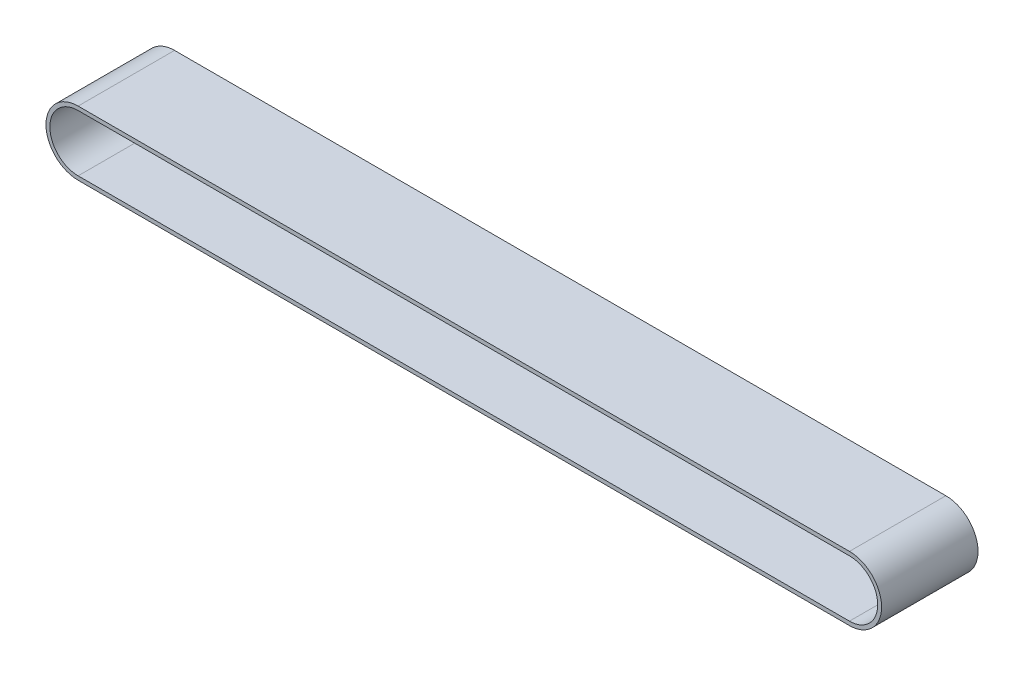
ISO-10303-21;
HEADER;
FILE_DESCRIPTION(('STEP AP214'),'2;1');
FILE_NAME('part.step','',(''),(''),'','','');
FILE_SCHEMA(('AUTOMOTIVE_DESIGN { 1 0 10303 214 1 1 1 1 }'));
ENDSEC;
DATA;
#1=APPLICATION_CONTEXT('core data for automotive mechanical design processes');
#2=APPLICATION_PROTOCOL_DEFINITION('international standard','automotive_design',2000,#1);
#3=PRODUCT_CONTEXT('',#1,'mechanical');
#4=PRODUCT('Part','Part','',(#3));
#5=PRODUCT_RELATED_PRODUCT_CATEGORY('part','',(#4));
#6=PRODUCT_DEFINITION_FORMATION('','',#4);
#7=PRODUCT_DEFINITION_CONTEXT('part definition',#1,'design');
#8=PRODUCT_DEFINITION('design','',#6,#7);
#9=PRODUCT_DEFINITION_SHAPE('','',#8);
#10=(LENGTH_UNIT() NAMED_UNIT(*) SI_UNIT(.MILLI.,.METRE.));
#11=(NAMED_UNIT(*) PLANE_ANGLE_UNIT() SI_UNIT($,.RADIAN.));
#12=(NAMED_UNIT(*) SI_UNIT($,.STERADIAN.) SOLID_ANGLE_UNIT());
#13=UNCERTAINTY_MEASURE_WITH_UNIT(LENGTH_MEASURE(1.E-05),#10,'distance_accuracy_value','');
#14=(GEOMETRIC_REPRESENTATION_CONTEXT(3) GLOBAL_UNCERTAINTY_ASSIGNED_CONTEXT((#13)) GLOBAL_UNIT_ASSIGNED_CONTEXT((#10,
#11,#12)) REPRESENTATION_CONTEXT('',''));
#15=CARTESIAN_POINT('',(0.,0.,0.));
#16=DIRECTION('',(0.,0.,1.));
#17=DIRECTION('',(1.,0.,0.));
#18=AXIS2_PLACEMENT_3D('',#15,#16,#17);
#19=CARTESIAN_POINT('',(0.,-50.,75.));
#20=DIRECTION('',(0.,1.,0.));
#21=DIRECTION('',(0.,0.,1.));
#22=AXIS2_PLACEMENT_3D('',#19,#20,#21);
#23=PLANE('',#22);
#24=DIRECTION('',(1.,0.,0.));
#25=VECTOR('',#24,1.);
#26=CARTESIAN_POINT('',(0.,-50.,-75.));
#27=LINE('',#26,#25);
#28=CARTESIAN_POINT('',(0.,-50.,-75.));
#29=VERTEX_POINT('',#28);
#30=CARTESIAN_POINT('',(1200.,-50.,-75.));
#31=VERTEX_POINT('',#30);
#32=EDGE_CURVE('E152',#29,#31,#27,.T.);
#33=ORIENTED_EDGE('',*,*,#32,.T.);
#34=DIRECTION('',(0.,0.,-1.));
#35=VECTOR('',#34,1.);
#36=CARTESIAN_POINT('',(1200.,-50.,75.));
#37=LINE('',#36,#35);
#38=CARTESIAN_POINT('',(1200.,-50.,75.));
#39=VERTEX_POINT('',#38);
#40=EDGE_CURVE('E11',#39,#31,#37,.T.);
#41=ORIENTED_EDGE('',*,*,#40,.F.);
#42=DIRECTION('',(1.,0.,0.));
#43=VECTOR('',#42,1.);
#44=CARTESIAN_POINT('',(0.,-50.,75.));
#45=LINE('',#44,#43);
#46=CARTESIAN_POINT('',(0.,-50.,75.));
#47=VERTEX_POINT('',#46);
#48=EDGE_CURVE('E123',#47,#39,#45,.T.);
#49=ORIENTED_EDGE('',*,*,#48,.F.);
#50=DIRECTION('',(0.,0.,-1.));
#51=VECTOR('',#50,1.);
#52=CARTESIAN_POINT('',(0.,-50.,75.));
#53=LINE('',#52,#51);
#54=EDGE_CURVE('E160',#47,#29,#53,.T.);
#55=ORIENTED_EDGE('',*,*,#54,.T.);
#56=EDGE_LOOP('',(#33,#41,#49,#55));
#57=FACE_BOUND('',#56,.T.);
#58=ADVANCED_FACE('F46',(#57),#23,.F.);
#59=CARTESIAN_POINT('',(1200.,0.,75.));
#60=DIRECTION('',(0.,0.,-1.));
#61=DIRECTION('',(-1.,0.,0.));
#62=AXIS2_PLACEMENT_3D('',#59,#60,#61);
#63=CYLINDRICAL_SURFACE('',#62,50.);
#64=CARTESIAN_POINT('',(1200.,0.,-75.));
#65=DIRECTION('',(0.,0.,1.));
#66=DIRECTION('',(1.,0.,0.));
#67=AXIS2_PLACEMENT_3D('',#64,#65,#66);
#68=CIRCLE('',#67,50.);
#69=CARTESIAN_POINT('',(1200.,50.,-75.));
#70=VERTEX_POINT('',#69);
#71=EDGE_CURVE('E129',#31,#70,#68,.T.);
#72=ORIENTED_EDGE('',*,*,#71,.T.);
#73=DIRECTION('',(0.,0.,-1.));
#74=VECTOR('',#73,1.);
#75=CARTESIAN_POINT('',(1200.,50.,75.));
#76=LINE('',#75,#74);
#77=CARTESIAN_POINT('',(1200.,50.,75.));
#78=VERTEX_POINT('',#77);
#79=EDGE_CURVE('E56',#78,#70,#76,.T.);
#80=ORIENTED_EDGE('',*,*,#79,.F.);
#81=CARTESIAN_POINT('',(1200.,0.,75.));
#82=DIRECTION('',(0.,0.,1.));
#83=DIRECTION('',(1.,0.,0.));
#84=AXIS2_PLACEMENT_3D('',#81,#82,#83);
#85=CIRCLE('',#84,50.);
#86=EDGE_CURVE('E117',#39,#78,#85,.T.);
#87=ORIENTED_EDGE('',*,*,#86,.F.);
#88=ORIENTED_EDGE('',*,*,#40,.T.);
#89=EDGE_LOOP('',(#72,#80,#87,#88));
#90=FACE_BOUND('',#89,.T.);
#91=ADVANCED_FACE('F128',(#90),#63,.T.);
#92=CARTESIAN_POINT('',(0.,50.,75.));
#93=DIRECTION('',(0.,1.,0.));
#94=DIRECTION('',(0.,0.,1.));
#95=AXIS2_PLACEMENT_3D('',#92,#93,#94);
#96=PLANE('',#95);
#97=DIRECTION('',(1.,0.,0.));
#98=VECTOR('',#97,1.);
#99=CARTESIAN_POINT('',(0.,50.,-75.));
#100=LINE('',#99,#98);
#101=CARTESIAN_POINT('',(0.,50.,-75.));
#102=VERTEX_POINT('',#101);
#103=EDGE_CURVE('E156',#102,#70,#100,.T.);
#104=ORIENTED_EDGE('',*,*,#103,.F.);
#105=DIRECTION('',(0.,0.,-1.));
#106=VECTOR('',#105,1.);
#107=CARTESIAN_POINT('',(0.,50.,75.));
#108=LINE('',#107,#106);
#109=CARTESIAN_POINT('',(0.,50.,75.));
#110=VERTEX_POINT('',#109);
#111=EDGE_CURVE('E93',#110,#102,#108,.T.);
#112=ORIENTED_EDGE('',*,*,#111,.F.);
#113=DIRECTION('',(1.,0.,0.));
#114=VECTOR('',#113,1.);
#115=CARTESIAN_POINT('',(0.,50.,75.));
#116=LINE('',#115,#114);
#117=EDGE_CURVE('E121',#110,#78,#116,.T.);
#118=ORIENTED_EDGE('',*,*,#117,.T.);
#119=ORIENTED_EDGE('',*,*,#79,.T.);
#120=EDGE_LOOP('',(#104,#112,#118,#119));
#121=FACE_BOUND('',#120,.T.);
#122=ADVANCED_FACE('F134',(#121),#96,.T.);
#123=CARTESIAN_POINT('',(0.,0.,75.));
#124=DIRECTION('',(0.,0.,-1.));
#125=DIRECTION('',(-1.,0.,0.));
#126=AXIS2_PLACEMENT_3D('',#123,#124,#125);
#127=CYLINDRICAL_SURFACE('',#126,44.);
#128=CARTESIAN_POINT('',(0.,0.,-75.));
#129=DIRECTION('',(0.,0.,1.));
#130=DIRECTION('',(1.,0.,0.));
#131=AXIS2_PLACEMENT_3D('',#128,#129,#130);
#132=CIRCLE('',#131,44.);
#133=CARTESIAN_POINT('',(0.,44.,-75.));
#134=VERTEX_POINT('',#133);
#135=CARTESIAN_POINT('',(0.,-44.,-75.));
#136=VERTEX_POINT('',#135);
#137=EDGE_CURVE('E140',#134,#136,#132,.T.);
#138=ORIENTED_EDGE('',*,*,#137,.F.);
#139=DIRECTION('',(0.,0.,-1.));
#140=VECTOR('',#139,1.);
#141=CARTESIAN_POINT('',(0.,44.,75.));
#142=LINE('',#141,#140);
#143=CARTESIAN_POINT('',(0.,44.,75.));
#144=VERTEX_POINT('',#143);
#145=EDGE_CURVE('E50',#144,#134,#142,.T.);
#146=ORIENTED_EDGE('',*,*,#145,.F.);
#147=CARTESIAN_POINT('',(0.,0.,75.));
#148=DIRECTION('',(0.,0.,1.));
#149=DIRECTION('',(1.,0.,0.));
#150=AXIS2_PLACEMENT_3D('',#147,#148,#149);
#151=CIRCLE('',#150,44.);
#152=CARTESIAN_POINT('',(0.,-44.,75.));
#153=VERTEX_POINT('',#152);
#154=EDGE_CURVE('E159',#144,#153,#151,.T.);
#155=ORIENTED_EDGE('',*,*,#154,.T.);
#156=DIRECTION('',(0.,0.,-1.));
#157=VECTOR('',#156,1.);
#158=CARTESIAN_POINT('',(0.,-44.,75.));
#159=LINE('',#158,#157);
#160=EDGE_CURVE('E136',#153,#136,#159,.T.);
#161=ORIENTED_EDGE('',*,*,#160,.T.);
#162=EDGE_LOOP('',(#138,#146,#155,#161));
#163=FACE_BOUND('',#162,.T.);
#164=ADVANCED_FACE('F48',(#163),#127,.F.);
#165=CARTESIAN_POINT('',(0.,44.,75.));
#166=DIRECTION('',(0.,1.,0.));
#167=DIRECTION('',(-1.,0.,0.));
#168=AXIS2_PLACEMENT_3D('',#165,#166,#167);
#169=PLANE('',#168);
#170=DIRECTION('',(1.,0.,0.));
#171=VECTOR('',#170,1.);
#172=CARTESIAN_POINT('',(0.,44.,-75.));
#173=LINE('',#172,#171);
#174=CARTESIAN_POINT('',(1200.,44.,-75.));
#175=VERTEX_POINT('',#174);
#176=EDGE_CURVE('E143',#134,#175,#173,.T.);
#177=ORIENTED_EDGE('',*,*,#176,.T.);
#178=DIRECTION('',(0.,0.,-1.));
#179=VECTOR('',#178,1.);
#180=CARTESIAN_POINT('',(1200.,44.,75.));
#181=LINE('',#180,#179);
#182=CARTESIAN_POINT('',(1200.,44.,75.));
#183=VERTEX_POINT('',#182);
#184=EDGE_CURVE('E165',#183,#175,#181,.T.);
#185=ORIENTED_EDGE('',*,*,#184,.F.);
#186=DIRECTION('',(1.,0.,0.));
#187=VECTOR('',#186,1.);
#188=CARTESIAN_POINT('',(0.,44.,75.));
#189=LINE('',#188,#187);
#190=EDGE_CURVE('E173',#144,#183,#189,.T.);
#191=ORIENTED_EDGE('',*,*,#190,.F.);
#192=ORIENTED_EDGE('',*,*,#145,.T.);
#193=EDGE_LOOP('',(#177,#185,#191,#192));
#194=FACE_BOUND('',#193,.T.);
#195=ADVANCED_FACE('F172',(#194),#169,.F.);
#196=CARTESIAN_POINT('',(1200.,0.,75.));
#197=DIRECTION('',(0.,0.,-1.));
#198=DIRECTION('',(-1.,0.,0.));
#199=AXIS2_PLACEMENT_3D('',#196,#197,#198);
#200=CYLINDRICAL_SURFACE('',#199,44.);
#201=CARTESIAN_POINT('',(1200.,0.,-75.));
#202=DIRECTION('',(0.,0.,1.));
#203=DIRECTION('',(1.,0.,0.));
#204=AXIS2_PLACEMENT_3D('',#201,#202,#203);
#205=CIRCLE('',#204,44.);
#206=CARTESIAN_POINT('',(1200.,-44.,-75.));
#207=VERTEX_POINT('',#206);
#208=EDGE_CURVE('E146',#207,#175,#205,.T.);
#209=ORIENTED_EDGE('',*,*,#208,.F.);
#210=DIRECTION('',(0.,0.,-1.));
#211=VECTOR('',#210,1.);
#212=CARTESIAN_POINT('',(1200.,-44.,75.));
#213=LINE('',#212,#211);
#214=CARTESIAN_POINT('',(1200.,-44.,75.));
#215=VERTEX_POINT('',#214);
#216=EDGE_CURVE('E164',#215,#207,#213,.T.);
#217=ORIENTED_EDGE('',*,*,#216,.F.);
#218=CARTESIAN_POINT('',(1200.,0.,75.));
#219=DIRECTION('',(0.,0.,1.));
#220=DIRECTION('',(1.,0.,0.));
#221=AXIS2_PLACEMENT_3D('',#218,#219,#220);
#222=CIRCLE('',#221,44.);
#223=EDGE_CURVE('E213',#215,#183,#222,.T.);
#224=ORIENTED_EDGE('',*,*,#223,.T.);
#225=ORIENTED_EDGE('',*,*,#184,.T.);
#226=EDGE_LOOP('',(#209,#217,#224,#225));
#227=FACE_BOUND('',#226,.T.);
#228=ADVANCED_FACE('F185',(#227),#200,.F.);
#229=CARTESIAN_POINT('',(0.,-44.,75.));
#230=DIRECTION('',(0.,1.,0.));
#231=DIRECTION('',(-1.,0.,0.));
#232=AXIS2_PLACEMENT_3D('',#229,#230,#231);
#233=PLANE('',#232);
#234=DIRECTION('',(1.,0.,0.));
#235=VECTOR('',#234,1.);
#236=CARTESIAN_POINT('',(0.,-44.,-75.));
#237=LINE('',#236,#235);
#238=EDGE_CURVE('E149',#136,#207,#237,.T.);
#239=ORIENTED_EDGE('',*,*,#238,.F.);
#240=ORIENTED_EDGE('',*,*,#160,.F.);
#241=DIRECTION('',(1.,0.,0.));
#242=VECTOR('',#241,1.);
#243=CARTESIAN_POINT('',(0.,-44.,75.));
#244=LINE('',#243,#242);
#245=EDGE_CURVE('E183',#153,#215,#244,.T.);
#246=ORIENTED_EDGE('',*,*,#245,.T.);
#247=ORIENTED_EDGE('',*,*,#216,.T.);
#248=EDGE_LOOP('',(#239,#240,#246,#247));
#249=FACE_BOUND('',#248,.T.);
#250=ADVANCED_FACE('F182',(#249),#233,.T.);
#251=CARTESIAN_POINT('',(0.,0.,75.));
#252=DIRECTION('',(0.,0.,-1.));
#253=DIRECTION('',(-1.,0.,0.));
#254=AXIS2_PLACEMENT_3D('',#251,#252,#253);
#255=CYLINDRICAL_SURFACE('',#254,50.);
#256=CARTESIAN_POINT('',(0.,0.,-75.));
#257=DIRECTION('',(0.,0.,1.));
#258=DIRECTION('',(1.,0.,0.));
#259=AXIS2_PLACEMENT_3D('',#256,#257,#258);
#260=CIRCLE('',#259,50.);
#261=EDGE_CURVE('E96',#102,#29,#260,.T.);
#262=ORIENTED_EDGE('',*,*,#261,.T.);
#263=ORIENTED_EDGE('',*,*,#54,.F.);
#264=CARTESIAN_POINT('',(0.,0.,75.));
#265=DIRECTION('',(0.,0.,1.));
#266=DIRECTION('',(1.,0.,0.));
#267=AXIS2_PLACEMENT_3D('',#264,#265,#266);
#268=CIRCLE('',#267,50.);
#269=EDGE_CURVE('E65',#110,#47,#268,.T.);
#270=ORIENTED_EDGE('',*,*,#269,.F.);
#271=ORIENTED_EDGE('',*,*,#111,.T.);
#272=EDGE_LOOP('',(#262,#263,#270,#271));
#273=FACE_BOUND('',#272,.T.);
#274=ADVANCED_FACE('F192',(#273),#255,.T.);
#275=CARTESIAN_POINT('',(0.,0.,75.));
#276=DIRECTION('',(0.,0.,1.));
#277=DIRECTION('',(1.,0.,0.));
#278=AXIS2_PLACEMENT_3D('',#275,#276,#277);
#279=PLANE('',#278);
#280=ORIENTED_EDGE('',*,*,#154,.F.);
#281=ORIENTED_EDGE('',*,*,#190,.T.);
#282=ORIENTED_EDGE('',*,*,#223,.F.);
#283=ORIENTED_EDGE('',*,*,#245,.F.);
#284=EDGE_LOOP('',(#280,#281,#282,#283));
#285=FACE_BOUND('',#284,.T.);
#286=ORIENTED_EDGE('',*,*,#48,.T.);
#287=ORIENTED_EDGE('',*,*,#86,.T.);
#288=ORIENTED_EDGE('',*,*,#117,.F.);
#289=ORIENTED_EDGE('',*,*,#269,.T.);
#290=EDGE_LOOP('',(#286,#287,#288,#289));
#291=FACE_BOUND('',#290,.T.);
#292=ADVANCED_FACE('F119',(#285,#291),#279,.T.);
#293=CARTESIAN_POINT('',(0.,0.,-75.));
#294=DIRECTION('',(0.,0.,1.));
#295=DIRECTION('',(1.,0.,0.));
#296=AXIS2_PLACEMENT_3D('',#293,#294,#295);
#297=PLANE('',#296);
#298=ORIENTED_EDGE('',*,*,#137,.T.);
#299=ORIENTED_EDGE('',*,*,#238,.T.);
#300=ORIENTED_EDGE('',*,*,#208,.T.);
#301=ORIENTED_EDGE('',*,*,#176,.F.);
#302=EDGE_LOOP('',(#298,#299,#300,#301));
#303=FACE_BOUND('',#302,.T.);
#304=ORIENTED_EDGE('',*,*,#32,.F.);
#305=ORIENTED_EDGE('',*,*,#261,.F.);
#306=ORIENTED_EDGE('',*,*,#103,.T.);
#307=ORIENTED_EDGE('',*,*,#71,.F.);
#308=EDGE_LOOP('',(#304,#305,#306,#307));
#309=FACE_BOUND('',#308,.T.);
#310=ADVANCED_FACE('F176',(#303,#309),#297,.F.);
#311=CLOSED_SHELL('',(#58,#91,#122,#164,#195,#228,#250,#274,#292,#310));
#312=MANIFOLD_SOLID_BREP('B2',#311);
#313=ADVANCED_BREP_SHAPE_REPRESENTATION('',(#18,#312),#14);
#314=SHAPE_DEFINITION_REPRESENTATION(#9,#313);
ENDSEC;
END-ISO-10303-21;
